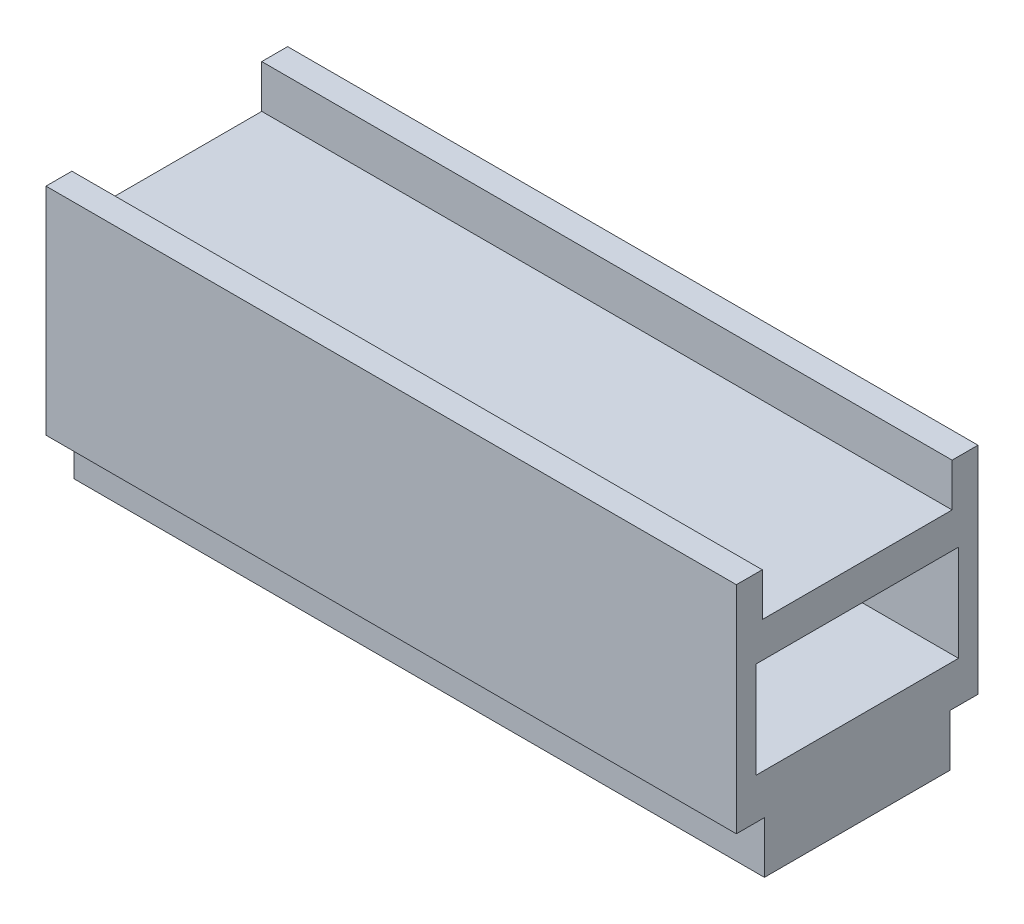
ISO-10303-21;
HEADER;
FILE_DESCRIPTION(('STEP AP214'),'2;1');
FILE_NAME('part.step','',(''),(''),'','','');
FILE_SCHEMA(('AUTOMOTIVE_DESIGN { 1 0 10303 214 1 1 1 1 }'));
ENDSEC;
DATA;
#1=APPLICATION_CONTEXT('core data for automotive mechanical design processes');
#2=APPLICATION_PROTOCOL_DEFINITION('international standard','automotive_design',2000,#1);
#3=PRODUCT_CONTEXT('',#1,'mechanical');
#4=PRODUCT('Part','Part','',(#3));
#5=PRODUCT_RELATED_PRODUCT_CATEGORY('part','',(#4));
#6=PRODUCT_DEFINITION_FORMATION('','',#4);
#7=PRODUCT_DEFINITION_CONTEXT('part definition',#1,'design');
#8=PRODUCT_DEFINITION('design','',#6,#7);
#9=PRODUCT_DEFINITION_SHAPE('','',#8);
#10=(LENGTH_UNIT() NAMED_UNIT(*) SI_UNIT(.MILLI.,.METRE.));
#11=(NAMED_UNIT(*) PLANE_ANGLE_UNIT() SI_UNIT($,.RADIAN.));
#12=(NAMED_UNIT(*) SI_UNIT($,.STERADIAN.) SOLID_ANGLE_UNIT());
#13=UNCERTAINTY_MEASURE_WITH_UNIT(LENGTH_MEASURE(1.E-05),#10,'distance_accuracy_value','');
#14=(GEOMETRIC_REPRESENTATION_CONTEXT(3) GLOBAL_UNCERTAINTY_ASSIGNED_CONTEXT((#13)) GLOBAL_UNIT_ASSIGNED_CONTEXT((#10,
#11,#12)) REPRESENTATION_CONTEXT('',''));
#15=CARTESIAN_POINT('',(0.,0.,0.));
#16=DIRECTION('',(0.,0.,1.));
#17=DIRECTION('',(1.,0.,0.));
#18=AXIS2_PLACEMENT_3D('',#15,#16,#17);
#19=CARTESIAN_POINT('',(0.,31.,0.));
#20=DIRECTION('',(0.,1.,0.));
#21=DIRECTION('',(0.,0.,1.));
#22=AXIS2_PLACEMENT_3D('',#19,#20,#21);
#23=PLANE('',#22);
#24=DIRECTION('',(-1.,0.,0.));
#25=VECTOR('',#24,1.);
#26=CARTESIAN_POINT('',(-40.,31.,-11.));
#27=LINE('',#26,#25);
#28=CARTESIAN_POINT('',(40.,31.,-11.));
#29=VERTEX_POINT('',#28);
#30=CARTESIAN_POINT('',(-40.,31.,-11.));
#31=VERTEX_POINT('',#30);
#32=EDGE_CURVE('E167',#29,#31,#27,.T.);
#33=ORIENTED_EDGE('',*,*,#32,.F.);
#34=DIRECTION('',(0.,0.,-1.));
#35=VECTOR('',#34,1.);
#36=CARTESIAN_POINT('',(40.,31.,-14.));
#37=LINE('',#36,#35);
#38=CARTESIAN_POINT('',(40.,31.,-14.));
#39=VERTEX_POINT('',#38);
#40=EDGE_CURVE('E220',#29,#39,#37,.T.);
#41=ORIENTED_EDGE('',*,*,#40,.T.);
#42=DIRECTION('',(-1.,0.,0.));
#43=VECTOR('',#42,1.);
#44=CARTESIAN_POINT('',(-40.,31.,-14.));
#45=LINE('',#44,#43);
#46=CARTESIAN_POINT('',(-40.,31.,-14.));
#47=VERTEX_POINT('',#46);
#48=EDGE_CURVE('E216',#39,#47,#45,.T.);
#49=ORIENTED_EDGE('',*,*,#48,.T.);
#50=DIRECTION('',(0.,0.,1.));
#51=VECTOR('',#50,1.);
#52=CARTESIAN_POINT('',(-40.,31.,-14.));
#53=LINE('',#52,#51);
#54=EDGE_CURVE('E219',#47,#31,#53,.T.);
#55=ORIENTED_EDGE('',*,*,#54,.T.);
#56=EDGE_LOOP('',(#33,#41,#49,#55));
#57=FACE_BOUND('',#56,.T.);
#58=ADVANCED_FACE('F39',(#57),#23,.T.);
#59=CARTESIAN_POINT('',(40.,6.,-10.75));
#60=DIRECTION('',(-1.,0.,0.));
#61=DIRECTION('',(0.,0.,1.));
#62=AXIS2_PLACEMENT_3D('',#59,#60,#61);
#63=PLANE('',#62);
#64=DIRECTION('',(0.,0.,1.));
#65=VECTOR('',#64,1.);
#66=CARTESIAN_POINT('',(40.,21.9006712008091,11.7433662398209));
#67=LINE('',#66,#65);
#68=CARTESIAN_POINT('',(40.,21.9006712008091,-11.7433662398209));
#69=VERTEX_POINT('',#68);
#70=CARTESIAN_POINT('',(40.,21.9006712008091,11.7433662398209));
#71=VERTEX_POINT('',#70);
#72=EDGE_CURVE('E175',#69,#71,#67,.T.);
#73=ORIENTED_EDGE('',*,*,#72,.F.);
#74=DIRECTION('',(0.,1.,0.));
#75=VECTOR('',#74,1.);
#76=CARTESIAN_POINT('',(40.,21.9006712008091,-11.7433662398209));
#77=LINE('',#76,#75);
#78=CARTESIAN_POINT('',(40.,10.7374914143469,-11.7433662398209));
#79=VERTEX_POINT('',#78);
#80=EDGE_CURVE('E53',#79,#69,#77,.T.);
#81=ORIENTED_EDGE('',*,*,#80,.F.);
#82=DIRECTION('',(0.,0.,-1.));
#83=VECTOR('',#82,1.);
#84=CARTESIAN_POINT('',(40.,10.7374914143469,11.7433662398209));
#85=LINE('',#84,#83);
#86=CARTESIAN_POINT('',(40.,10.7374914143469,11.7433662398209));
#87=VERTEX_POINT('',#86);
#88=EDGE_CURVE('E159',#87,#79,#85,.T.);
#89=ORIENTED_EDGE('',*,*,#88,.F.);
#90=DIRECTION('',(0.,-1.,0.));
#91=VECTOR('',#90,1.);
#92=CARTESIAN_POINT('',(40.,21.9006712008091,11.7433662398209));
#93=LINE('',#92,#91);
#94=EDGE_CURVE('E180',#71,#87,#93,.T.);
#95=ORIENTED_EDGE('',*,*,#94,.F.);
#96=EDGE_LOOP('',(#73,#81,#89,#95));
#97=FACE_BOUND('',#96,.T.);
#98=DIRECTION('',(0.,0.,-1.));
#99=VECTOR('',#98,1.);
#100=CARTESIAN_POINT('',(40.,26.,-11.));
#101=LINE('',#100,#99);
#102=CARTESIAN_POINT('',(40.,26.,11.));
#103=VERTEX_POINT('',#102);
#104=CARTESIAN_POINT('',(40.,26.,-11.));
#105=VERTEX_POINT('',#104);
#106=EDGE_CURVE('E190',#103,#105,#101,.T.);
#107=ORIENTED_EDGE('',*,*,#106,.F.);
#108=DIRECTION('',(0.,1.,0.));
#109=VECTOR('',#108,1.);
#110=CARTESIAN_POINT('',(40.,26.,11.));
#111=LINE('',#110,#109);
#112=CARTESIAN_POINT('',(40.,31.,11.));
#113=VERTEX_POINT('',#112);
#114=EDGE_CURVE('E201',#103,#113,#111,.T.);
#115=ORIENTED_EDGE('',*,*,#114,.T.);
#116=CARTESIAN_POINT('',(40.,31.,14.));
#117=VERTEX_POINT('',#116);
#118=EDGE_CURVE('E213',#117,#113,#37,.T.);
#119=ORIENTED_EDGE('',*,*,#118,.F.);
#120=DIRECTION('',(0.,-1.,0.));
#121=VECTOR('',#120,1.);
#122=CARTESIAN_POINT('',(40.,31.,14.));
#123=LINE('',#122,#121);
#124=CARTESIAN_POINT('',(40.,6.,14.));
#125=VERTEX_POINT('',#124);
#126=EDGE_CURVE('E223',#117,#125,#123,.T.);
#127=ORIENTED_EDGE('',*,*,#126,.T.);
#128=DIRECTION('',(0.,0.,-1.));
#129=VECTOR('',#128,1.);
#130=CARTESIAN_POINT('',(40.,6.,-14.));
#131=LINE('',#130,#129);
#132=CARTESIAN_POINT('',(40.,6.,10.75));
#133=VERTEX_POINT('',#132);
#134=EDGE_CURVE('E228',#125,#133,#131,.T.);
#135=ORIENTED_EDGE('',*,*,#134,.T.);
#136=DIRECTION('',(0.,-1.,0.));
#137=VECTOR('',#136,1.);
#138=CARTESIAN_POINT('',(40.,6.,10.75));
#139=LINE('',#138,#137);
#140=CARTESIAN_POINT('',(40.,0.,10.75));
#141=VERTEX_POINT('',#140);
#142=EDGE_CURVE('E258',#133,#141,#139,.T.);
#143=ORIENTED_EDGE('',*,*,#142,.T.);
#144=DIRECTION('',(0.,0.,-1.));
#145=VECTOR('',#144,1.);
#146=CARTESIAN_POINT('',(40.,0.,-10.75));
#147=LINE('',#146,#145);
#148=CARTESIAN_POINT('',(40.,0.,-10.75));
#149=VERTEX_POINT('',#148);
#150=EDGE_CURVE('E249',#141,#149,#147,.T.);
#151=ORIENTED_EDGE('',*,*,#150,.T.);
#152=DIRECTION('',(0.,-1.,0.));
#153=VECTOR('',#152,1.);
#154=CARTESIAN_POINT('',(40.,6.,-10.75));
#155=LINE('',#154,#153);
#156=CARTESIAN_POINT('',(40.,6.,-10.75));
#157=VERTEX_POINT('',#156);
#158=EDGE_CURVE('E11',#157,#149,#155,.T.);
#159=ORIENTED_EDGE('',*,*,#158,.F.);
#160=CARTESIAN_POINT('',(40.,6.,-14.));
#161=VERTEX_POINT('',#160);
#162=EDGE_CURVE('E206',#157,#161,#131,.T.);
#163=ORIENTED_EDGE('',*,*,#162,.T.);
#164=DIRECTION('',(0.,-1.,0.));
#165=VECTOR('',#164,1.);
#166=CARTESIAN_POINT('',(40.,31.,-14.));
#167=LINE('',#166,#165);
#168=EDGE_CURVE('E241',#39,#161,#167,.T.);
#169=ORIENTED_EDGE('',*,*,#168,.F.);
#170=ORIENTED_EDGE('',*,*,#40,.F.);
#171=DIRECTION('',(0.,1.,0.));
#172=VECTOR('',#171,1.);
#173=CARTESIAN_POINT('',(40.,26.,-11.));
#174=LINE('',#173,#172);
#175=EDGE_CURVE('E199',#105,#29,#174,.T.);
#176=ORIENTED_EDGE('',*,*,#175,.F.);
#177=EDGE_LOOP('',(#107,#115,#119,#127,#135,#143,#151,#159,#163,#169,#170,#176));
#178=FACE_BOUND('',#177,.T.);
#179=ADVANCED_FACE('F41',(#97,#178),#63,.F.);
#180=CARTESIAN_POINT('',(-40.,6.,-10.75));
#181=DIRECTION('',(0.,0.,1.));
#182=DIRECTION('',(1.,0.,0.));
#183=AXIS2_PLACEMENT_3D('',#180,#181,#182);
#184=PLANE('',#183);
#185=DIRECTION('',(-1.,0.,0.));
#186=VECTOR('',#185,1.);
#187=CARTESIAN_POINT('',(-40.,0.,-10.75));
#188=LINE('',#187,#186);
#189=CARTESIAN_POINT('',(-40.,0.,-10.75));
#190=VERTEX_POINT('',#189);
#191=EDGE_CURVE('E259',#149,#190,#188,.T.);
#192=ORIENTED_EDGE('',*,*,#191,.T.);
#193=DIRECTION('',(0.,-1.,0.));
#194=VECTOR('',#193,1.);
#195=CARTESIAN_POINT('',(-40.,6.,-10.75));
#196=LINE('',#195,#194);
#197=CARTESIAN_POINT('',(-40.,6.,-10.75));
#198=VERTEX_POINT('',#197);
#199=EDGE_CURVE('E50',#198,#190,#196,.T.);
#200=ORIENTED_EDGE('',*,*,#199,.F.);
#201=DIRECTION('',(-1.,0.,0.));
#202=VECTOR('',#201,1.);
#203=CARTESIAN_POINT('',(-40.,6.,-10.75));
#204=LINE('',#203,#202);
#205=EDGE_CURVE('E248',#157,#198,#204,.T.);
#206=ORIENTED_EDGE('',*,*,#205,.F.);
#207=ORIENTED_EDGE('',*,*,#158,.T.);
#208=EDGE_LOOP('',(#192,#200,#206,#207));
#209=FACE_BOUND('',#208,.T.);
#210=ADVANCED_FACE('F319',(#209),#184,.F.);
#211=CARTESIAN_POINT('',(-40.,6.,-10.75));
#212=DIRECTION('',(1.,0.,0.));
#213=DIRECTION('',(0.,0.,-1.));
#214=AXIS2_PLACEMENT_3D('',#211,#212,#213);
#215=PLANE('',#214);
#216=DIRECTION('',(0.,0.,1.));
#217=VECTOR('',#216,1.);
#218=CARTESIAN_POINT('',(-40.,10.7374914143469,11.7433662398209));
#219=LINE('',#218,#217);
#220=CARTESIAN_POINT('',(-40.,10.7374914143469,-11.7433662398209));
#221=VERTEX_POINT('',#220);
#222=CARTESIAN_POINT('',(-40.,10.7374914143469,11.7433662398209));
#223=VERTEX_POINT('',#222);
#224=EDGE_CURVE('E174',#221,#223,#219,.T.);
#225=ORIENTED_EDGE('',*,*,#224,.F.);
#226=DIRECTION('',(0.,-1.,0.));
#227=VECTOR('',#226,1.);
#228=CARTESIAN_POINT('',(-40.,21.9006712008091,-11.7433662398209));
#229=LINE('',#228,#227);
#230=CARTESIAN_POINT('',(-40.,21.9006712008091,-11.7433662398209));
#231=VERTEX_POINT('',#230);
#232=EDGE_CURVE('E152',#231,#221,#229,.T.);
#233=ORIENTED_EDGE('',*,*,#232,.F.);
#234=DIRECTION('',(0.,0.,-1.));
#235=VECTOR('',#234,1.);
#236=CARTESIAN_POINT('',(-40.,21.9006712008091,11.7433662398209));
#237=LINE('',#236,#235);
#238=CARTESIAN_POINT('',(-40.,21.9006712008091,11.7433662398209));
#239=VERTEX_POINT('',#238);
#240=EDGE_CURVE('E162',#239,#231,#237,.T.);
#241=ORIENTED_EDGE('',*,*,#240,.F.);
#242=DIRECTION('',(0.,1.,0.));
#243=VECTOR('',#242,1.);
#244=CARTESIAN_POINT('',(-40.,21.9006712008091,11.7433662398209));
#245=LINE('',#244,#243);
#246=EDGE_CURVE('E64',#223,#239,#245,.T.);
#247=ORIENTED_EDGE('',*,*,#246,.F.);
#248=EDGE_LOOP('',(#225,#233,#241,#247));
#249=FACE_BOUND('',#248,.T.);
#250=DIRECTION('',(0.,0.,1.));
#251=VECTOR('',#250,1.);
#252=CARTESIAN_POINT('',(-40.,26.,-11.));
#253=LINE('',#252,#251);
#254=CARTESIAN_POINT('',(-40.,26.,-11.));
#255=VERTEX_POINT('',#254);
#256=CARTESIAN_POINT('',(-40.,26.,11.));
#257=VERTEX_POINT('',#256);
#258=EDGE_CURVE('E195',#255,#257,#253,.T.);
#259=ORIENTED_EDGE('',*,*,#258,.F.);
#260=DIRECTION('',(0.,1.,0.));
#261=VECTOR('',#260,1.);
#262=CARTESIAN_POINT('',(-40.,26.,-11.));
#263=LINE('',#262,#261);
#264=EDGE_CURVE('E207',#255,#31,#263,.T.);
#265=ORIENTED_EDGE('',*,*,#264,.T.);
#266=ORIENTED_EDGE('',*,*,#54,.F.);
#267=DIRECTION('',(0.,-1.,0.));
#268=VECTOR('',#267,1.);
#269=CARTESIAN_POINT('',(-40.,31.,-14.));
#270=LINE('',#269,#268);
#271=CARTESIAN_POINT('',(-40.,6.,-14.));
#272=VERTEX_POINT('',#271);
#273=EDGE_CURVE('E244',#47,#272,#270,.T.);
#274=ORIENTED_EDGE('',*,*,#273,.T.);
#275=DIRECTION('',(0.,0.,1.));
#276=VECTOR('',#275,1.);
#277=CARTESIAN_POINT('',(-40.,6.,-14.));
#278=LINE('',#277,#276);
#279=EDGE_CURVE('E232',#272,#198,#278,.T.);
#280=ORIENTED_EDGE('',*,*,#279,.T.);
#281=ORIENTED_EDGE('',*,*,#199,.T.);
#282=DIRECTION('',(0.,0.,1.));
#283=VECTOR('',#282,1.);
#284=CARTESIAN_POINT('',(-40.,0.,-10.75));
#285=LINE('',#284,#283);
#286=CARTESIAN_POINT('',(-40.,0.,10.75));
#287=VERTEX_POINT('',#286);
#288=EDGE_CURVE('E261',#190,#287,#285,.T.);
#289=ORIENTED_EDGE('',*,*,#288,.T.);
#290=DIRECTION('',(0.,-1.,0.));
#291=VECTOR('',#290,1.);
#292=CARTESIAN_POINT('',(-40.,6.,10.75));
#293=LINE('',#292,#291);
#294=CARTESIAN_POINT('',(-40.,6.,10.75));
#295=VERTEX_POINT('',#294);
#296=EDGE_CURVE('E266',#295,#287,#293,.T.);
#297=ORIENTED_EDGE('',*,*,#296,.F.);
#298=CARTESIAN_POINT('',(-40.,6.,14.));
#299=VERTEX_POINT('',#298);
#300=EDGE_CURVE('E231',#295,#299,#278,.T.);
#301=ORIENTED_EDGE('',*,*,#300,.T.);
#302=DIRECTION('',(0.,-1.,0.));
#303=VECTOR('',#302,1.);
#304=CARTESIAN_POINT('',(-40.,31.,14.));
#305=LINE('',#304,#303);
#306=CARTESIAN_POINT('',(-40.,31.,14.));
#307=VERTEX_POINT('',#306);
#308=EDGE_CURVE('E239',#307,#299,#305,.T.);
#309=ORIENTED_EDGE('',*,*,#308,.F.);
#310=CARTESIAN_POINT('',(-40.,31.,11.));
#311=VERTEX_POINT('',#310);
#312=EDGE_CURVE('E218',#311,#307,#53,.T.);
#313=ORIENTED_EDGE('',*,*,#312,.F.);
#314=DIRECTION('',(0.,1.,0.));
#315=VECTOR('',#314,1.);
#316=CARTESIAN_POINT('',(-40.,26.,11.));
#317=LINE('',#316,#315);
#318=EDGE_CURVE('E210',#257,#311,#317,.T.);
#319=ORIENTED_EDGE('',*,*,#318,.F.);
#320=EDGE_LOOP('',(#259,#265,#266,#274,#280,#281,#289,#297,#301,#309,#313,#319));
#321=FACE_BOUND('',#320,.T.);
#322=ADVANCED_FACE('F166',(#249,#321),#215,.F.);
#323=CARTESIAN_POINT('',(-40.,6.,10.75));
#324=DIRECTION('',(0.,0.,-1.));
#325=DIRECTION('',(-1.,0.,0.));
#326=AXIS2_PLACEMENT_3D('',#323,#324,#325);
#327=PLANE('',#326);
#328=DIRECTION('',(1.,0.,0.));
#329=VECTOR('',#328,1.);
#330=CARTESIAN_POINT('',(-40.,0.,10.75));
#331=LINE('',#330,#329);
#332=EDGE_CURVE('E251',#287,#141,#331,.T.);
#333=ORIENTED_EDGE('',*,*,#332,.T.);
#334=ORIENTED_EDGE('',*,*,#142,.F.);
#335=DIRECTION('',(1.,0.,0.));
#336=VECTOR('',#335,1.);
#337=CARTESIAN_POINT('',(-40.,6.,10.75));
#338=LINE('',#337,#336);
#339=EDGE_CURVE('E252',#295,#133,#338,.T.);
#340=ORIENTED_EDGE('',*,*,#339,.F.);
#341=ORIENTED_EDGE('',*,*,#296,.T.);
#342=EDGE_LOOP('',(#333,#334,#340,#341));
#343=FACE_BOUND('',#342,.T.);
#344=ADVANCED_FACE('F279',(#343),#327,.F.);
#345=CARTESIAN_POINT('',(0.,0.,0.));
#346=DIRECTION('',(0.,1.,0.));
#347=DIRECTION('',(0.,0.,1.));
#348=AXIS2_PLACEMENT_3D('',#345,#346,#347);
#349=PLANE('',#348);
#350=ORIENTED_EDGE('',*,*,#150,.F.);
#351=ORIENTED_EDGE('',*,*,#332,.F.);
#352=ORIENTED_EDGE('',*,*,#288,.F.);
#353=ORIENTED_EDGE('',*,*,#191,.F.);
#354=EDGE_LOOP('',(#350,#351,#352,#353));
#355=FACE_BOUND('',#354,.T.);
#356=ADVANCED_FACE('F277',(#355),#349,.F.);
#357=CARTESIAN_POINT('',(0.,6.,0.));
#358=DIRECTION('',(0.,1.,0.));
#359=DIRECTION('',(0.,0.,1.));
#360=AXIS2_PLACEMENT_3D('',#357,#358,#359);
#361=PLANE('',#360);
#362=ORIENTED_EDGE('',*,*,#162,.F.);
#363=ORIENTED_EDGE('',*,*,#205,.T.);
#364=ORIENTED_EDGE('',*,*,#279,.F.);
#365=DIRECTION('',(-1.,0.,0.));
#366=VECTOR('',#365,1.);
#367=CARTESIAN_POINT('',(-40.,6.,-14.));
#368=LINE('',#367,#366);
#369=EDGE_CURVE('E230',#161,#272,#368,.T.);
#370=ORIENTED_EDGE('',*,*,#369,.F.);
#371=EDGE_LOOP('',(#362,#363,#364,#370));
#372=FACE_BOUND('',#371,.T.);
#373=ADVANCED_FACE('F317',(#372),#361,.F.);
#374=ORIENTED_EDGE('',*,*,#300,.F.);
#375=ORIENTED_EDGE('',*,*,#339,.T.);
#376=ORIENTED_EDGE('',*,*,#134,.F.);
#377=DIRECTION('',(1.,0.,0.));
#378=VECTOR('',#377,1.);
#379=CARTESIAN_POINT('',(-40.,6.,14.));
#380=LINE('',#379,#378);
#381=EDGE_CURVE('E235',#299,#125,#380,.T.);
#382=ORIENTED_EDGE('',*,*,#381,.F.);
#383=EDGE_LOOP('',(#374,#375,#376,#382));
#384=FACE_BOUND('',#383,.T.);
#385=ADVANCED_FACE('F288',(#384),#361,.F.);
#386=CARTESIAN_POINT('',(-40.,31.,-14.));
#387=DIRECTION('',(0.,0.,1.));
#388=DIRECTION('',(1.,0.,0.));
#389=AXIS2_PLACEMENT_3D('',#386,#387,#388);
#390=PLANE('',#389);
#391=ORIENTED_EDGE('',*,*,#369,.T.);
#392=ORIENTED_EDGE('',*,*,#273,.F.);
#393=ORIENTED_EDGE('',*,*,#48,.F.);
#394=ORIENTED_EDGE('',*,*,#168,.T.);
#395=EDGE_LOOP('',(#391,#392,#393,#394));
#396=FACE_BOUND('',#395,.T.);
#397=ADVANCED_FACE('F321',(#396),#390,.F.);
#398=CARTESIAN_POINT('',(-40.,31.,14.));
#399=DIRECTION('',(0.,0.,-1.));
#400=DIRECTION('',(-1.,0.,0.));
#401=AXIS2_PLACEMENT_3D('',#398,#399,#400);
#402=PLANE('',#401);
#403=ORIENTED_EDGE('',*,*,#381,.T.);
#404=ORIENTED_EDGE('',*,*,#126,.F.);
#405=DIRECTION('',(1.,0.,0.));
#406=VECTOR('',#405,1.);
#407=CARTESIAN_POINT('',(-40.,31.,14.));
#408=LINE('',#407,#406);
#409=EDGE_CURVE('E224',#307,#117,#408,.T.);
#410=ORIENTED_EDGE('',*,*,#409,.F.);
#411=ORIENTED_EDGE('',*,*,#308,.T.);
#412=EDGE_LOOP('',(#403,#404,#410,#411));
#413=FACE_BOUND('',#412,.T.);
#414=ADVANCED_FACE('F294',(#413),#402,.F.);
#415=DIRECTION('',(1.,0.,0.));
#416=VECTOR('',#415,1.);
#417=CARTESIAN_POINT('',(-40.,31.,11.));
#418=LINE('',#417,#416);
#419=EDGE_CURVE('E194',#311,#113,#418,.T.);
#420=ORIENTED_EDGE('',*,*,#419,.F.);
#421=ORIENTED_EDGE('',*,*,#312,.T.);
#422=ORIENTED_EDGE('',*,*,#409,.T.);
#423=ORIENTED_EDGE('',*,*,#118,.T.);
#424=EDGE_LOOP('',(#420,#421,#422,#423));
#425=FACE_BOUND('',#424,.T.);
#426=ADVANCED_FACE('F299',(#425),#23,.T.);
#427=CARTESIAN_POINT('',(-40.,26.,11.));
#428=DIRECTION('',(0.,0.,1.));
#429=DIRECTION('',(1.,0.,0.));
#430=AXIS2_PLACEMENT_3D('',#427,#428,#429);
#431=PLANE('',#430);
#432=ORIENTED_EDGE('',*,*,#419,.T.);
#433=ORIENTED_EDGE('',*,*,#114,.F.);
#434=DIRECTION('',(1.,0.,0.));
#435=VECTOR('',#434,1.);
#436=CARTESIAN_POINT('',(-40.,26.,11.));
#437=LINE('',#436,#435);
#438=EDGE_CURVE('E197',#257,#103,#437,.T.);
#439=ORIENTED_EDGE('',*,*,#438,.F.);
#440=ORIENTED_EDGE('',*,*,#318,.T.);
#441=EDGE_LOOP('',(#432,#433,#439,#440));
#442=FACE_BOUND('',#441,.T.);
#443=ADVANCED_FACE('F301',(#442),#431,.F.);
#444=CARTESIAN_POINT('',(-40.,26.,-11.));
#445=DIRECTION('',(0.,0.,-1.));
#446=DIRECTION('',(-1.,0.,0.));
#447=AXIS2_PLACEMENT_3D('',#444,#445,#446);
#448=PLANE('',#447);
#449=ORIENTED_EDGE('',*,*,#32,.T.);
#450=ORIENTED_EDGE('',*,*,#264,.F.);
#451=DIRECTION('',(-1.,0.,0.));
#452=VECTOR('',#451,1.);
#453=CARTESIAN_POINT('',(-40.,26.,-11.));
#454=LINE('',#453,#452);
#455=EDGE_CURVE('E192',#105,#255,#454,.T.);
#456=ORIENTED_EDGE('',*,*,#455,.F.);
#457=ORIENTED_EDGE('',*,*,#175,.T.);
#458=EDGE_LOOP('',(#449,#450,#456,#457));
#459=FACE_BOUND('',#458,.T.);
#460=ADVANCED_FACE('F310',(#459),#448,.F.);
#461=CARTESIAN_POINT('',(0.,26.,0.));
#462=DIRECTION('',(0.,1.,0.));
#463=DIRECTION('',(0.,0.,1.));
#464=AXIS2_PLACEMENT_3D('',#461,#462,#463);
#465=PLANE('',#464);
#466=ORIENTED_EDGE('',*,*,#106,.T.);
#467=ORIENTED_EDGE('',*,*,#455,.T.);
#468=ORIENTED_EDGE('',*,*,#258,.T.);
#469=ORIENTED_EDGE('',*,*,#438,.T.);
#470=EDGE_LOOP('',(#466,#467,#468,#469));
#471=FACE_BOUND('',#470,.T.);
#472=ADVANCED_FACE('F304',(#471),#465,.T.);
#473=CARTESIAN_POINT('',(-40.001,21.9006712008091,-11.7433662398209));
#474=DIRECTION('',(0.,0.,-1.));
#475=DIRECTION('',(-1.,0.,0.));
#476=AXIS2_PLACEMENT_3D('',#473,#474,#475);
#477=PLANE('',#476);
#478=ORIENTED_EDGE('',*,*,#232,.T.);
#479=DIRECTION('',(1.,0.,0.));
#480=VECTOR('',#479,1.);
#481=CARTESIAN_POINT('',(-40.001,10.7374914143469,-11.7433662398209));
#482=LINE('',#481,#480);
#483=EDGE_CURVE('E170',#221,#79,#482,.T.);
#484=ORIENTED_EDGE('',*,*,#483,.T.);
#485=ORIENTED_EDGE('',*,*,#80,.T.);
#486=DIRECTION('',(1.,0.,0.));
#487=VECTOR('',#486,1.);
#488=CARTESIAN_POINT('',(-40.001,21.9006712008091,-11.7433662398209));
#489=LINE('',#488,#487);
#490=EDGE_CURVE('E147',#231,#69,#489,.T.);
#491=ORIENTED_EDGE('',*,*,#490,.F.);
#492=EDGE_LOOP('',(#478,#484,#485,#491));
#493=FACE_BOUND('',#492,.T.);
#494=ADVANCED_FACE('F155',(#493),#477,.F.);
#495=CARTESIAN_POINT('',(-40.001,10.7374914143469,11.7433662398209));
#496=DIRECTION('',(0.,-1.,0.));
#497=DIRECTION('',(0.,0.,-1.));
#498=AXIS2_PLACEMENT_3D('',#495,#496,#497);
#499=PLANE('',#498);
#500=ORIENTED_EDGE('',*,*,#224,.T.);
#501=DIRECTION('',(1.,0.,0.));
#502=VECTOR('',#501,1.);
#503=CARTESIAN_POINT('',(-40.001,10.7374914143469,11.7433662398209));
#504=LINE('',#503,#502);
#505=EDGE_CURVE('E188',#223,#87,#504,.T.);
#506=ORIENTED_EDGE('',*,*,#505,.T.);
#507=ORIENTED_EDGE('',*,*,#88,.T.);
#508=ORIENTED_EDGE('',*,*,#483,.F.);
#509=EDGE_LOOP('',(#500,#506,#507,#508));
#510=FACE_BOUND('',#509,.T.);
#511=ADVANCED_FACE('F353',(#510),#499,.F.);
#512=CARTESIAN_POINT('',(-40.001,21.9006712008091,11.7433662398209));
#513=DIRECTION('',(0.,0.,1.));
#514=DIRECTION('',(1.,0.,0.));
#515=AXIS2_PLACEMENT_3D('',#512,#513,#514);
#516=PLANE('',#515);
#517=ORIENTED_EDGE('',*,*,#246,.T.);
#518=DIRECTION('',(1.,0.,0.));
#519=VECTOR('',#518,1.);
#520=CARTESIAN_POINT('',(-40.001,21.9006712008091,11.7433662398209));
#521=LINE('',#520,#519);
#522=EDGE_CURVE('E157',#239,#71,#521,.T.);
#523=ORIENTED_EDGE('',*,*,#522,.T.);
#524=ORIENTED_EDGE('',*,*,#94,.T.);
#525=ORIENTED_EDGE('',*,*,#505,.F.);
#526=EDGE_LOOP('',(#517,#523,#524,#525));
#527=FACE_BOUND('',#526,.T.);
#528=ADVANCED_FACE('F355',(#527),#516,.F.);
#529=CARTESIAN_POINT('',(-40.001,21.9006712008091,11.7433662398209));
#530=DIRECTION('',(0.,1.,0.));
#531=DIRECTION('',(0.,0.,1.));
#532=AXIS2_PLACEMENT_3D('',#529,#530,#531);
#533=PLANE('',#532);
#534=ORIENTED_EDGE('',*,*,#240,.T.);
#535=ORIENTED_EDGE('',*,*,#490,.T.);
#536=ORIENTED_EDGE('',*,*,#72,.T.);
#537=ORIENTED_EDGE('',*,*,#522,.F.);
#538=EDGE_LOOP('',(#534,#535,#536,#537));
#539=FACE_BOUND('',#538,.T.);
#540=ADVANCED_FACE('F163',(#539),#533,.F.);
#541=CLOSED_SHELL('',(#58,#179,#210,#322,#344,#356,#373,#385,#397,#414,#426,#443,#460,#472,#494,
#511,#528,#540));
#542=MANIFOLD_SOLID_BREP('B2',#541);
#543=ADVANCED_BREP_SHAPE_REPRESENTATION('',(#18,#542),#14);
#544=SHAPE_DEFINITION_REPRESENTATION(#9,#543);
ENDSEC;
END-ISO-10303-21;
